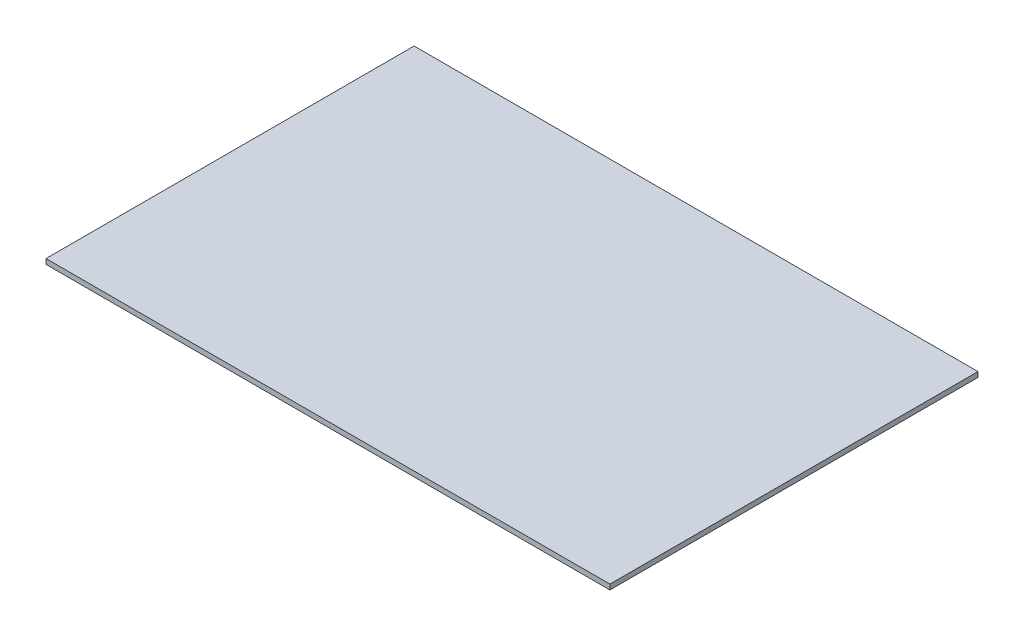
ISO-10303-21;
HEADER;
FILE_DESCRIPTION(('STEP AP214'),'2;1');
FILE_NAME('part.step','',(''),(''),'','','');
FILE_SCHEMA(('AUTOMOTIVE_DESIGN { 1 0 10303 214 1 1 1 1 }'));
ENDSEC;
DATA;
#1=APPLICATION_CONTEXT('core data for automotive mechanical design processes');
#2=APPLICATION_PROTOCOL_DEFINITION('international standard','automotive_design',2000,#1);
#3=PRODUCT_CONTEXT('',#1,'mechanical');
#4=PRODUCT('Part','Part','',(#3));
#5=PRODUCT_RELATED_PRODUCT_CATEGORY('part','',(#4));
#6=PRODUCT_DEFINITION_FORMATION('','',#4);
#7=PRODUCT_DEFINITION_CONTEXT('part definition',#1,'design');
#8=PRODUCT_DEFINITION('design','',#6,#7);
#9=PRODUCT_DEFINITION_SHAPE('','',#8);
#10=(LENGTH_UNIT() NAMED_UNIT(*) SI_UNIT(.MILLI.,.METRE.));
#11=(NAMED_UNIT(*) PLANE_ANGLE_UNIT() SI_UNIT($,.RADIAN.));
#12=(NAMED_UNIT(*) SI_UNIT($,.STERADIAN.) SOLID_ANGLE_UNIT());
#13=UNCERTAINTY_MEASURE_WITH_UNIT(LENGTH_MEASURE(1.E-05),#10,'distance_accuracy_value','');
#14=(GEOMETRIC_REPRESENTATION_CONTEXT(3) GLOBAL_UNCERTAINTY_ASSIGNED_CONTEXT((#13)) GLOBAL_UNIT_ASSIGNED_CONTEXT((#10,
#11,#12)) REPRESENTATION_CONTEXT('',''));
#15=CARTESIAN_POINT('',(0.,0.,0.));
#16=DIRECTION('',(0.,0.,1.));
#17=DIRECTION('',(1.,0.,0.));
#18=AXIS2_PLACEMENT_3D('',#15,#16,#17);
#19=CARTESIAN_POINT('',(-720.,219.,-470.));
#20=DIRECTION('',(1.,0.,0.));
#21=DIRECTION('',(0.,0.,-1.));
#22=AXIS2_PLACEMENT_3D('',#19,#20,#21);
#23=PLANE('',#22);
#24=DIRECTION('',(0.,0.,1.));
#25=VECTOR('',#24,1.);
#26=CARTESIAN_POINT('',(-720.,206.,-470.));
#27=LINE('',#26,#25);
#28=CARTESIAN_POINT('',(-720.,206.,-470.));
#29=VERTEX_POINT('',#28);
#30=CARTESIAN_POINT('',(-720.,206.,470.));
#31=VERTEX_POINT('',#30);
#32=EDGE_CURVE('E99',#29,#31,#27,.T.);
#33=ORIENTED_EDGE('',*,*,#32,.T.);
#34=DIRECTION('',(0.,-1.,0.));
#35=VECTOR('',#34,1.);
#36=CARTESIAN_POINT('',(-720.,219.,470.));
#37=LINE('',#36,#35);
#38=CARTESIAN_POINT('',(-720.,219.,470.));
#39=VERTEX_POINT('',#38);
#40=EDGE_CURVE('E11',#39,#31,#37,.T.);
#41=ORIENTED_EDGE('',*,*,#40,.F.);
#42=DIRECTION('',(0.,0.,1.));
#43=VECTOR('',#42,1.);
#44=CARTESIAN_POINT('',(-720.,219.,-470.));
#45=LINE('',#44,#43);
#46=CARTESIAN_POINT('',(-720.,219.,-470.));
#47=VERTEX_POINT('',#46);
#48=EDGE_CURVE('E87',#47,#39,#45,.T.);
#49=ORIENTED_EDGE('',*,*,#48,.F.);
#50=DIRECTION('',(0.,-1.,0.));
#51=VECTOR('',#50,1.);
#52=CARTESIAN_POINT('',(-720.,219.,-470.));
#53=LINE('',#52,#51);
#54=EDGE_CURVE('E95',#47,#29,#53,.T.);
#55=ORIENTED_EDGE('',*,*,#54,.T.);
#56=EDGE_LOOP('',(#33,#41,#49,#55));
#57=FACE_BOUND('',#56,.T.);
#58=ADVANCED_FACE('F36',(#57),#23,.F.);
#59=CARTESIAN_POINT('',(-720.,219.,470.));
#60=DIRECTION('',(0.,0.,-1.));
#61=DIRECTION('',(0.,1.,0.));
#62=AXIS2_PLACEMENT_3D('',#59,#60,#61);
#63=PLANE('',#62);
#64=DIRECTION('',(1.,0.,0.));
#65=VECTOR('',#64,1.);
#66=CARTESIAN_POINT('',(-720.,206.,470.));
#67=LINE('',#66,#65);
#68=CARTESIAN_POINT('',(720.,206.,470.));
#69=VERTEX_POINT('',#68);
#70=EDGE_CURVE('E91',#31,#69,#67,.T.);
#71=ORIENTED_EDGE('',*,*,#70,.T.);
#72=DIRECTION('',(0.,-1.,0.));
#73=VECTOR('',#72,1.);
#74=CARTESIAN_POINT('',(720.,219.,470.));
#75=LINE('',#74,#73);
#76=CARTESIAN_POINT('',(720.,219.,470.));
#77=VERTEX_POINT('',#76);
#78=EDGE_CURVE('E44',#77,#69,#75,.T.);
#79=ORIENTED_EDGE('',*,*,#78,.F.);
#80=DIRECTION('',(1.,0.,0.));
#81=VECTOR('',#80,1.);
#82=CARTESIAN_POINT('',(-720.,219.,470.));
#83=LINE('',#82,#81);
#84=EDGE_CURVE('E82',#39,#77,#83,.T.);
#85=ORIENTED_EDGE('',*,*,#84,.F.);
#86=ORIENTED_EDGE('',*,*,#40,.T.);
#87=EDGE_LOOP('',(#71,#79,#85,#86));
#88=FACE_BOUND('',#87,.T.);
#89=ADVANCED_FACE('F90',(#88),#63,.F.);
#90=CARTESIAN_POINT('',(720.,219.,-470.));
#91=DIRECTION('',(-1.,0.,0.));
#92=DIRECTION('',(0.,0.,1.));
#93=AXIS2_PLACEMENT_3D('',#90,#91,#92);
#94=PLANE('',#93);
#95=DIRECTION('',(0.,0.,-1.));
#96=VECTOR('',#95,1.);
#97=CARTESIAN_POINT('',(720.,206.,-470.));
#98=LINE('',#97,#96);
#99=CARTESIAN_POINT('',(720.,206.,-470.));
#100=VERTEX_POINT('',#99);
#101=EDGE_CURVE('E69',#69,#100,#98,.T.);
#102=ORIENTED_EDGE('',*,*,#101,.T.);
#103=DIRECTION('',(0.,-1.,0.));
#104=VECTOR('',#103,1.);
#105=CARTESIAN_POINT('',(720.,219.,-470.));
#106=LINE('',#105,#104);
#107=CARTESIAN_POINT('',(720.,219.,-470.));
#108=VERTEX_POINT('',#107);
#109=EDGE_CURVE('E92',#108,#100,#106,.T.);
#110=ORIENTED_EDGE('',*,*,#109,.F.);
#111=DIRECTION('',(0.,0.,-1.));
#112=VECTOR('',#111,1.);
#113=CARTESIAN_POINT('',(720.,219.,-470.));
#114=LINE('',#113,#112);
#115=EDGE_CURVE('E85',#77,#108,#114,.T.);
#116=ORIENTED_EDGE('',*,*,#115,.F.);
#117=ORIENTED_EDGE('',*,*,#78,.T.);
#118=EDGE_LOOP('',(#102,#110,#116,#117));
#119=FACE_BOUND('',#118,.T.);
#120=ADVANCED_FACE('F93',(#119),#94,.F.);
#121=CARTESIAN_POINT('',(-720.,219.,-470.));
#122=DIRECTION('',(0.,0.,1.));
#123=DIRECTION('',(0.,-1.,0.));
#124=AXIS2_PLACEMENT_3D('',#121,#122,#123);
#125=PLANE('',#124);
#126=DIRECTION('',(-1.,0.,0.));
#127=VECTOR('',#126,1.);
#128=CARTESIAN_POINT('',(-720.,206.,-470.));
#129=LINE('',#128,#127);
#130=EDGE_CURVE('E75',#100,#29,#129,.T.);
#131=ORIENTED_EDGE('',*,*,#130,.T.);
#132=ORIENTED_EDGE('',*,*,#54,.F.);
#133=DIRECTION('',(-1.,0.,0.));
#134=VECTOR('',#133,1.);
#135=CARTESIAN_POINT('',(-720.,219.,-470.));
#136=LINE('',#135,#134);
#137=EDGE_CURVE('E52',#108,#47,#136,.T.);
#138=ORIENTED_EDGE('',*,*,#137,.F.);
#139=ORIENTED_EDGE('',*,*,#109,.T.);
#140=EDGE_LOOP('',(#131,#132,#138,#139));
#141=FACE_BOUND('',#140,.T.);
#142=ADVANCED_FACE('F106',(#141),#125,.F.);
#143=CARTESIAN_POINT('',(0.,219.,0.));
#144=DIRECTION('',(0.,1.,0.));
#145=DIRECTION('',(0.,0.,1.));
#146=AXIS2_PLACEMENT_3D('',#143,#144,#145);
#147=PLANE('',#146);
#148=ORIENTED_EDGE('',*,*,#48,.T.);
#149=ORIENTED_EDGE('',*,*,#84,.T.);
#150=ORIENTED_EDGE('',*,*,#115,.T.);
#151=ORIENTED_EDGE('',*,*,#137,.T.);
#152=EDGE_LOOP('',(#148,#149,#150,#151));
#153=FACE_BOUND('',#152,.T.);
#154=ADVANCED_FACE('F83',(#153),#147,.T.);
#155=CARTESIAN_POINT('',(0.,206.,0.));
#156=DIRECTION('',(0.,1.,0.));
#157=DIRECTION('',(0.,0.,1.));
#158=AXIS2_PLACEMENT_3D('',#155,#156,#157);
#159=PLANE('',#158);
#160=ORIENTED_EDGE('',*,*,#32,.F.);
#161=ORIENTED_EDGE('',*,*,#130,.F.);
#162=ORIENTED_EDGE('',*,*,#101,.F.);
#163=ORIENTED_EDGE('',*,*,#70,.F.);
#164=EDGE_LOOP('',(#160,#161,#162,#163));
#165=FACE_BOUND('',#164,.T.);
#166=ADVANCED_FACE('F109',(#165),#159,.F.);
#167=CLOSED_SHELL('',(#58,#89,#120,#142,#154,#166));
#168=MANIFOLD_SOLID_BREP('B2',#167);
#169=ADVANCED_BREP_SHAPE_REPRESENTATION('',(#18,#168),#14);
#170=SHAPE_DEFINITION_REPRESENTATION(#9,#169);
ENDSEC;
END-ISO-10303-21;
